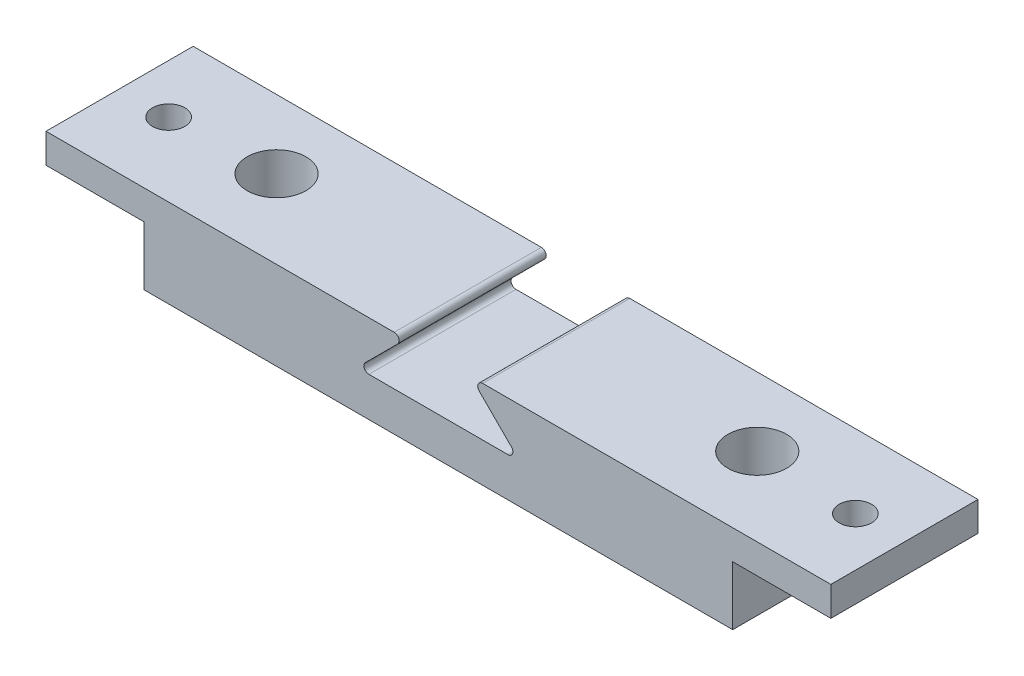
ISO-10303-21;
HEADER;
FILE_DESCRIPTION(('STEP AP214'),'2;1');
FILE_NAME('part.step','',(''),(''),'','','');
FILE_SCHEMA(('AUTOMOTIVE_DESIGN { 1 0 10303 214 1 1 1 1 }'));
ENDSEC;
DATA;
#1=APPLICATION_CONTEXT('core data for automotive mechanical design processes');
#2=APPLICATION_PROTOCOL_DEFINITION('international standard','automotive_design',2000,#1);
#3=PRODUCT_CONTEXT('',#1,'mechanical');
#4=PRODUCT('Part','Part','',(#3));
#5=PRODUCT_RELATED_PRODUCT_CATEGORY('part','',(#4));
#6=PRODUCT_DEFINITION_FORMATION('','',#4);
#7=PRODUCT_DEFINITION_CONTEXT('part definition',#1,'design');
#8=PRODUCT_DEFINITION('design','',#6,#7);
#9=PRODUCT_DEFINITION_SHAPE('','',#8);
#10=(LENGTH_UNIT() NAMED_UNIT(*) SI_UNIT(.MILLI.,.METRE.));
#11=(NAMED_UNIT(*) PLANE_ANGLE_UNIT() SI_UNIT($,.RADIAN.));
#12=(NAMED_UNIT(*) SI_UNIT($,.STERADIAN.) SOLID_ANGLE_UNIT());
#13=UNCERTAINTY_MEASURE_WITH_UNIT(LENGTH_MEASURE(1.E-05),#10,'distance_accuracy_value','');
#14=(GEOMETRIC_REPRESENTATION_CONTEXT(3) GLOBAL_UNCERTAINTY_ASSIGNED_CONTEXT((#13)) GLOBAL_UNIT_ASSIGNED_CONTEXT((#10,
#11,#12)) REPRESENTATION_CONTEXT('',''));
#15=CARTESIAN_POINT('',(0.,0.,0.));
#16=DIRECTION('',(0.,0.,1.));
#17=DIRECTION('',(1.,0.,0.));
#18=AXIS2_PLACEMENT_3D('',#15,#16,#17);
#19=CARTESIAN_POINT('',(0.,9.,0.));
#20=DIRECTION('',(0.,-1.,0.));
#21=DIRECTION('',(0.,0.,-1.));
#22=AXIS2_PLACEMENT_3D('',#19,#20,#21);
#23=PLANE('',#22);
#24=CARTESIAN_POINT('',(35.0000000000021,9.,0.));
#25=DIRECTION('',(0.,1.,0.));
#26=DIRECTION('',(0.,0.,1.));
#27=AXIS2_PLACEMENT_3D('',#24,#25,#26);
#28=CIRCLE('',#27,1.65);
#29=CARTESIAN_POINT('',(35.0000000000021,9.,1.65));
#30=VERTEX_POINT('',#29);
#31=EDGE_CURVE('E278',#30,#30,#28,.T.);
#32=ORIENTED_EDGE('',*,*,#31,.F.);
#33=EDGE_LOOP('',(#32));
#34=FACE_BOUND('',#33,.T.);
#35=CARTESIAN_POINT('',(24.5,9.,-0.500000000000009));
#36=DIRECTION('',(0.,1.,0.));
#37=DIRECTION('',(0.,0.,1.));
#38=AXIS2_PLACEMENT_3D('',#35,#36,#37);
#39=CIRCLE('',#38,3.);
#40=CARTESIAN_POINT('',(24.5,9.,2.49999999999999));
#41=VERTEX_POINT('',#40);
#42=EDGE_CURVE('E287',#41,#41,#39,.T.);
#43=ORIENTED_EDGE('',*,*,#42,.F.);
#44=EDGE_LOOP('',(#43));
#45=FACE_BOUND('',#44,.T.);
#46=DIRECTION('',(0.,0.,1.));
#47=VECTOR('',#46,1.);
#48=CARTESIAN_POINT('',(4.50710678118635,9.,-7.50000000000004));
#49=LINE('',#48,#47);
#50=CARTESIAN_POINT('',(4.50710678118635,9.,-7.50000000000004));
#51=VERTEX_POINT('',#50);
#52=CARTESIAN_POINT('',(4.50710678118635,9.,7.5));
#53=VERTEX_POINT('',#52);
#54=EDGE_CURVE('E267',#51,#53,#49,.T.);
#55=ORIENTED_EDGE('',*,*,#54,.T.);
#56=DIRECTION('',(-1.,0.,0.));
#57=VECTOR('',#56,1.);
#58=CARTESIAN_POINT('',(0.,9.,7.5));
#59=LINE('',#58,#57);
#60=CARTESIAN_POINT('',(40.,9.,7.49999999999996));
#61=VERTEX_POINT('',#60);
#62=EDGE_CURVE('E304',#61,#53,#59,.T.);
#63=ORIENTED_EDGE('',*,*,#62,.F.);
#64=DIRECTION('',(0.,0.,-1.));
#65=VECTOR('',#64,1.);
#66=CARTESIAN_POINT('',(40.,9.,0.));
#67=LINE('',#66,#65);
#68=CARTESIAN_POINT('',(40.,9.,-7.50000000000004));
#69=VERTEX_POINT('',#68);
#70=EDGE_CURVE('E307',#61,#69,#67,.T.);
#71=ORIENTED_EDGE('',*,*,#70,.T.);
#72=DIRECTION('',(-1.,0.,0.));
#73=VECTOR('',#72,1.);
#74=CARTESIAN_POINT('',(0.,9.,-7.50000000000004));
#75=LINE('',#74,#73);
#76=EDGE_CURVE('E296',#69,#51,#75,.T.);
#77=ORIENTED_EDGE('',*,*,#76,.T.);
#78=EDGE_LOOP('',(#55,#63,#71,#77));
#79=FACE_BOUND('',#78,.T.);
#80=ADVANCED_FACE('F95',(#34,#45,#79),#23,.F.);
#81=CARTESIAN_POINT('',(30.,6.,0.));
#82=DIRECTION('',(1.,0.,0.));
#83=DIRECTION('',(0.,0.,-1.));
#84=AXIS2_PLACEMENT_3D('',#81,#82,#83);
#85=PLANE('',#84);
#86=DIRECTION('',(0.,0.,1.));
#87=VECTOR('',#86,1.);
#88=CARTESIAN_POINT('',(30.,0.,0.));
#89=LINE('',#88,#87);
#90=CARTESIAN_POINT('',(30.,0.,-7.50000000000004));
#91=VERTEX_POINT('',#90);
#92=CARTESIAN_POINT('',(30.,0.,7.49999999999997));
#93=VERTEX_POINT('',#92);
#94=EDGE_CURVE('E344',#91,#93,#89,.T.);
#95=ORIENTED_EDGE('',*,*,#94,.F.);
#96=DIRECTION('',(0.,-1.,0.));
#97=VECTOR('',#96,1.);
#98=CARTESIAN_POINT('',(30.,6.,-7.50000000000004));
#99=LINE('',#98,#97);
#100=CARTESIAN_POINT('',(30.,6.,-7.50000000000004));
#101=VERTEX_POINT('',#100);
#102=EDGE_CURVE('E12',#101,#91,#99,.T.);
#103=ORIENTED_EDGE('',*,*,#102,.F.);
#104=DIRECTION('',(0.,0.,1.));
#105=VECTOR('',#104,1.);
#106=CARTESIAN_POINT('',(30.,6.,0.));
#107=LINE('',#106,#105);
#108=CARTESIAN_POINT('',(30.,6.,7.49999999999997));
#109=VERTEX_POINT('',#108);
#110=EDGE_CURVE('E333',#101,#109,#107,.T.);
#111=ORIENTED_EDGE('',*,*,#110,.T.);
#112=DIRECTION('',(0.,-1.,0.));
#113=VECTOR('',#112,1.);
#114=CARTESIAN_POINT('',(30.,6.,7.49999999999997));
#115=LINE('',#114,#113);
#116=EDGE_CURVE('E119',#109,#93,#115,.T.);
#117=ORIENTED_EDGE('',*,*,#116,.T.);
#118=EDGE_LOOP('',(#95,#103,#111,#117));
#119=FACE_BOUND('',#118,.T.);
#120=ADVANCED_FACE('F368',(#119),#85,.T.);
#121=CARTESIAN_POINT('',(0.,6.,-7.50000000000004));
#122=DIRECTION('',(0.,0.,-1.));
#123=DIRECTION('',(-1.,0.,0.));
#124=AXIS2_PLACEMENT_3D('',#121,#122,#123);
#125=PLANE('',#124);
#126=CARTESIAN_POINT('',(-4.50710678118635,8.5,-7.50000000000004));
#127=DIRECTION('',(0.,0.,-1.));
#128=DIRECTION('',(1.,0.,0.));
#129=AXIS2_PLACEMENT_3D('',#126,#127,#128);
#130=CIRCLE('',#129,0.500000000000001);
#131=CARTESIAN_POINT('',(-4.50710678118635,9.,-7.50000000000004));
#132=VERTEX_POINT('',#131);
#133=CARTESIAN_POINT('',(-4.15355339059305,8.14644660940674,-7.50000000000004));
#134=VERTEX_POINT('',#133);
#135=EDGE_CURVE('E248',#132,#134,#130,.T.);
#136=ORIENTED_EDGE('',*,*,#135,.T.);
#137=DIRECTION('',(-0.707106781186508,-0.707106781186587,0.));
#138=VECTOR('',#137,1.);
#139=CARTESIAN_POINT('',(-7.4464466094069,4.85355339059253,-7.50000000000004));
#140=LINE('',#139,#138);
#141=CARTESIAN_POINT('',(-7.4464466094069,4.85355339059253,-7.50000000000004));
#142=VERTEX_POINT('',#141);
#143=EDGE_CURVE('E218',#134,#142,#140,.T.);
#144=ORIENTED_EDGE('',*,*,#143,.T.);
#145=CARTESIAN_POINT('',(-7.09289321881361,4.49999999999928,-7.50000000000004));
#146=DIRECTION('',(0.,0.,1.));
#147=DIRECTION('',(1.,0.,0.));
#148=AXIS2_PLACEMENT_3D('',#145,#146,#147);
#149=CIRCLE('',#148,0.499999999999999);
#150=CARTESIAN_POINT('',(-7.09289321881361,3.99999999999928,-7.50000000000004));
#151=VERTEX_POINT('',#150);
#152=EDGE_CURVE('E251',#142,#151,#149,.T.);
#153=ORIENTED_EDGE('',*,*,#152,.T.);
#154=DIRECTION('',(1.,0.,0.));
#155=VECTOR('',#154,1.);
#156=CARTESIAN_POINT('',(7.09289321881361,3.99999999999928,-7.50000000000004));
#157=LINE('',#156,#155);
#158=CARTESIAN_POINT('',(7.09289321881361,3.99999999999928,-7.50000000000004));
#159=VERTEX_POINT('',#158);
#160=EDGE_CURVE('E254',#151,#159,#157,.T.);
#161=ORIENTED_EDGE('',*,*,#160,.T.);
#162=CARTESIAN_POINT('',(7.09289321881361,4.49999999999928,-7.50000000000004));
#163=DIRECTION('',(0.,0.,1.));
#164=DIRECTION('',(-1.,0.,0.));
#165=AXIS2_PLACEMENT_3D('',#162,#163,#164);
#166=CIRCLE('',#165,0.5);
#167=CARTESIAN_POINT('',(7.4464466094069,4.85355339059253,-7.50000000000004));
#168=VERTEX_POINT('',#167);
#169=EDGE_CURVE('E257',#159,#168,#166,.T.);
#170=ORIENTED_EDGE('',*,*,#169,.T.);
#171=DIRECTION('',(-0.707106781186508,0.707106781186587,0.));
#172=VECTOR('',#171,1.);
#173=CARTESIAN_POINT('',(4.15355339059305,8.14644660940674,-7.50000000000004));
#174=LINE('',#173,#172);
#175=CARTESIAN_POINT('',(4.15355339059305,8.14644660940674,-7.50000000000004));
#176=VERTEX_POINT('',#175);
#177=EDGE_CURVE('E260',#168,#176,#174,.T.);
#178=ORIENTED_EDGE('',*,*,#177,.T.);
#179=CARTESIAN_POINT('',(4.50710678118635,8.5,-7.50000000000004));
#180=DIRECTION('',(0.,0.,-1.));
#181=DIRECTION('',(1.,0.,0.));
#182=AXIS2_PLACEMENT_3D('',#179,#180,#181);
#183=CIRCLE('',#182,0.500000000000001);
#184=EDGE_CURVE('E222',#176,#51,#183,.T.);
#185=ORIENTED_EDGE('',*,*,#184,.T.);
#186=ORIENTED_EDGE('',*,*,#76,.F.);
#187=DIRECTION('',(0.,-1.,0.));
#188=VECTOR('',#187,1.);
#189=CARTESIAN_POINT('',(40.,9.,-7.50000000000004));
#190=LINE('',#189,#188);
#191=CARTESIAN_POINT('',(40.,6.,-7.50000000000004));
#192=VERTEX_POINT('',#191);
#193=EDGE_CURVE('E309',#69,#192,#190,.T.);
#194=ORIENTED_EDGE('',*,*,#193,.T.);
#195=DIRECTION('',(-1.,0.,0.));
#196=VECTOR('',#195,1.);
#197=CARTESIAN_POINT('',(0.,6.,-7.50000000000004));
#198=LINE('',#197,#196);
#199=EDGE_CURVE('E310',#192,#101,#198,.T.);
#200=ORIENTED_EDGE('',*,*,#199,.T.);
#201=ORIENTED_EDGE('',*,*,#102,.T.);
#202=DIRECTION('',(1.,0.,0.));
#203=VECTOR('',#202,1.);
#204=CARTESIAN_POINT('',(0.,0.,-7.50000000000004));
#205=LINE('',#204,#203);
#206=CARTESIAN_POINT('',(-30.,0.,-7.50000000000004));
#207=VERTEX_POINT('',#206);
#208=EDGE_CURVE('E347',#207,#91,#205,.T.);
#209=ORIENTED_EDGE('',*,*,#208,.F.);
#210=DIRECTION('',(0.,-1.,0.));
#211=VECTOR('',#210,1.);
#212=CARTESIAN_POINT('',(-30.,6.,-7.50000000000004));
#213=LINE('',#212,#211);
#214=CARTESIAN_POINT('',(-30.,6.,-7.50000000000004));
#215=VERTEX_POINT('',#214);
#216=EDGE_CURVE('E103',#215,#207,#213,.T.);
#217=ORIENTED_EDGE('',*,*,#216,.F.);
#218=CARTESIAN_POINT('',(-40.,6.,-7.50000000000004));
#219=VERTEX_POINT('',#218);
#220=EDGE_CURVE('E295',#215,#219,#198,.T.);
#221=ORIENTED_EDGE('',*,*,#220,.T.);
#222=DIRECTION('',(0.,-1.,0.));
#223=VECTOR('',#222,1.);
#224=CARTESIAN_POINT('',(-40.,9.,-7.50000000000004));
#225=LINE('',#224,#223);
#226=CARTESIAN_POINT('',(-40.,9.,-7.50000000000004));
#227=VERTEX_POINT('',#226);
#228=EDGE_CURVE('E329',#227,#219,#225,.T.);
#229=ORIENTED_EDGE('',*,*,#228,.F.);
#230=EDGE_CURVE('E300',#132,#227,#75,.T.);
#231=ORIENTED_EDGE('',*,*,#230,.F.);
#232=EDGE_LOOP('',(#136,#144,#153,#161,#170,#178,#185,#186,#194,#200,#201,#209,#217,#221,#229,#231));
#233=FACE_BOUND('',#232,.T.);
#234=ADVANCED_FACE('F366',(#233),#125,.T.);
#235=CARTESIAN_POINT('',(-30.,6.,0.));
#236=DIRECTION('',(1.,0.,0.));
#237=DIRECTION('',(0.,0.,-1.));
#238=AXIS2_PLACEMENT_3D('',#235,#236,#237);
#239=PLANE('',#238);
#240=DIRECTION('',(0.,0.,1.));
#241=VECTOR('',#240,1.);
#242=CARTESIAN_POINT('',(-30.,0.,0.));
#243=LINE('',#242,#241);
#244=CARTESIAN_POINT('',(-30.,0.,7.50000000000003));
#245=VERTEX_POINT('',#244);
#246=EDGE_CURVE('E350',#207,#245,#243,.T.);
#247=ORIENTED_EDGE('',*,*,#246,.T.);
#248=DIRECTION('',(0.,-1.,0.));
#249=VECTOR('',#248,1.);
#250=CARTESIAN_POINT('',(-30.,6.,7.50000000000003));
#251=LINE('',#250,#249);
#252=CARTESIAN_POINT('',(-30.,6.,7.50000000000003));
#253=VERTEX_POINT('',#252);
#254=EDGE_CURVE('E355',#253,#245,#251,.T.);
#255=ORIENTED_EDGE('',*,*,#254,.F.);
#256=DIRECTION('',(0.,0.,1.));
#257=VECTOR('',#256,1.);
#258=CARTESIAN_POINT('',(-30.,6.,0.));
#259=LINE('',#258,#257);
#260=EDGE_CURVE('E335',#215,#253,#259,.T.);
#261=ORIENTED_EDGE('',*,*,#260,.F.);
#262=ORIENTED_EDGE('',*,*,#216,.T.);
#263=EDGE_LOOP('',(#247,#255,#261,#262));
#264=FACE_BOUND('',#263,.T.);
#265=ADVANCED_FACE('F360',(#264),#239,.F.);
#266=CARTESIAN_POINT('',(-24.5,6.,-0.5));
#267=DIRECTION('',(0.,-1.,0.));
#268=DIRECTION('',(0.,0.,-1.));
#269=AXIS2_PLACEMENT_3D('',#266,#267,#268);
#270=CYLINDRICAL_SURFACE('',#269,3.);
#271=CARTESIAN_POINT('',(-24.5,0.,-0.5));
#272=DIRECTION('',(0.,1.,0.));
#273=DIRECTION('',(0.,0.,1.));
#274=AXIS2_PLACEMENT_3D('',#271,#272,#273);
#275=CIRCLE('',#274,3.);
#276=CARTESIAN_POINT('',(-24.5,0.,2.5));
#277=VERTEX_POINT('',#276);
#278=EDGE_CURVE('E341',#277,#277,#275,.T.);
#279=ORIENTED_EDGE('',*,*,#278,.F.);
#280=EDGE_LOOP('',(#279));
#281=FACE_BOUND('',#280,.T.);
#282=CARTESIAN_POINT('',(-24.5,9.,-0.5));
#283=DIRECTION('',(0.,1.,0.));
#284=DIRECTION('',(0.,0.,1.));
#285=AXIS2_PLACEMENT_3D('',#282,#283,#284);
#286=CIRCLE('',#285,3.);
#287=CARTESIAN_POINT('',(-24.5,9.,2.5));
#288=VERTEX_POINT('',#287);
#289=EDGE_CURVE('E292',#288,#288,#286,.T.);
#290=ORIENTED_EDGE('',*,*,#289,.T.);
#291=EDGE_LOOP('',(#290));
#292=FACE_BOUND('',#291,.T.);
#293=ADVANCED_FACE('F380',(#281,#292),#270,.F.);
#294=CARTESIAN_POINT('',(24.5,6.,-0.500000000000009));
#295=DIRECTION('',(0.,-1.,0.));
#296=DIRECTION('',(0.,0.,-1.));
#297=AXIS2_PLACEMENT_3D('',#294,#295,#296);
#298=CYLINDRICAL_SURFACE('',#297,3.);
#299=CARTESIAN_POINT('',(24.5,0.,-0.500000000000009));
#300=DIRECTION('',(0.,1.,0.));
#301=DIRECTION('',(0.,0.,1.));
#302=AXIS2_PLACEMENT_3D('',#299,#300,#301);
#303=CIRCLE('',#302,3.);
#304=CARTESIAN_POINT('',(24.5,0.,2.49999999999999));
#305=VERTEX_POINT('',#304);
#306=EDGE_CURVE('E332',#305,#305,#303,.T.);
#307=ORIENTED_EDGE('',*,*,#306,.F.);
#308=EDGE_LOOP('',(#307));
#309=FACE_BOUND('',#308,.T.);
#310=ORIENTED_EDGE('',*,*,#42,.T.);
#311=EDGE_LOOP('',(#310));
#312=FACE_BOUND('',#311,.T.);
#313=ADVANCED_FACE('F97',(#309,#312),#298,.F.);
#314=CARTESIAN_POINT('',(0.,6.,7.5));
#315=DIRECTION('',(0.,0.,-1.));
#316=DIRECTION('',(-1.,0.,0.));
#317=AXIS2_PLACEMENT_3D('',#314,#315,#316);
#318=PLANE('',#317);
#319=DIRECTION('',(-0.707106781186508,-0.707106781186587,0.));
#320=VECTOR('',#319,1.);
#321=CARTESIAN_POINT('',(-7.4464466094069,4.85355339059253,7.50000000000004));
#322=LINE('',#321,#320);
#323=CARTESIAN_POINT('',(-4.15355339059305,8.14644660940674,7.50000000000004));
#324=VERTEX_POINT('',#323);
#325=CARTESIAN_POINT('',(-7.4464466094069,4.85355339059253,7.50000000000004));
#326=VERTEX_POINT('',#325);
#327=EDGE_CURVE('E215',#324,#326,#322,.T.);
#328=ORIENTED_EDGE('',*,*,#327,.F.);
#329=CARTESIAN_POINT('',(-4.50710678118635,8.5,7.50000000000004));
#330=DIRECTION('',(0.,0.,-1.));
#331=DIRECTION('',(1.,0.,0.));
#332=AXIS2_PLACEMENT_3D('',#329,#330,#331);
#333=CIRCLE('',#332,0.500000000000001);
#334=CARTESIAN_POINT('',(-4.50710678118635,9.,7.50000000000004));
#335=VERTEX_POINT('',#334);
#336=EDGE_CURVE('E225',#335,#324,#333,.T.);
#337=ORIENTED_EDGE('',*,*,#336,.F.);
#338=CARTESIAN_POINT('',(-40.,9.,7.50000000000004));
#339=VERTEX_POINT('',#338);
#340=EDGE_CURVE('E303',#335,#339,#59,.T.);
#341=ORIENTED_EDGE('',*,*,#340,.T.);
#342=DIRECTION('',(0.,-1.,0.));
#343=VECTOR('',#342,1.);
#344=CARTESIAN_POINT('',(-40.,9.,7.50000000000004));
#345=LINE('',#344,#343);
#346=CARTESIAN_POINT('',(-40.,6.,7.50000000000004));
#347=VERTEX_POINT('',#346);
#348=EDGE_CURVE('E326',#339,#347,#345,.T.);
#349=ORIENTED_EDGE('',*,*,#348,.T.);
#350=DIRECTION('',(-1.,0.,0.));
#351=VECTOR('',#350,1.);
#352=CARTESIAN_POINT('',(0.,6.,7.5));
#353=LINE('',#352,#351);
#354=EDGE_CURVE('E316',#253,#347,#353,.T.);
#355=ORIENTED_EDGE('',*,*,#354,.F.);
#356=ORIENTED_EDGE('',*,*,#254,.T.);
#357=DIRECTION('',(1.,0.,0.));
#358=VECTOR('',#357,1.);
#359=CARTESIAN_POINT('',(0.,0.,7.5));
#360=LINE('',#359,#358);
#361=EDGE_CURVE('E336',#245,#93,#360,.T.);
#362=ORIENTED_EDGE('',*,*,#361,.T.);
#363=ORIENTED_EDGE('',*,*,#116,.F.);
#364=CARTESIAN_POINT('',(40.,6.,7.49999999999996));
#365=VERTEX_POINT('',#364);
#366=EDGE_CURVE('E317',#365,#109,#353,.T.);
#367=ORIENTED_EDGE('',*,*,#366,.F.);
#368=DIRECTION('',(0.,-1.,0.));
#369=VECTOR('',#368,1.);
#370=CARTESIAN_POINT('',(40.,9.,7.49999999999996));
#371=LINE('',#370,#369);
#372=EDGE_CURVE('E324',#61,#365,#371,.T.);
#373=ORIENTED_EDGE('',*,*,#372,.F.);
#374=ORIENTED_EDGE('',*,*,#62,.T.);
#375=CARTESIAN_POINT('',(4.50710678118635,8.5,7.50000000000004));
#376=DIRECTION('',(0.,0.,-1.));
#377=DIRECTION('',(1.,0.,0.));
#378=AXIS2_PLACEMENT_3D('',#375,#376,#377);
#379=CIRCLE('',#378,0.500000000000001);
#380=CARTESIAN_POINT('',(4.15355339059305,8.14644660940674,7.50000000000004));
#381=VERTEX_POINT('',#380);
#382=EDGE_CURVE('E110',#381,#53,#379,.T.);
#383=ORIENTED_EDGE('',*,*,#382,.F.);
#384=DIRECTION('',(-0.707106781186508,0.707106781186587,0.));
#385=VECTOR('',#384,1.);
#386=CARTESIAN_POINT('',(4.15355339059305,8.14644660940674,7.50000000000004));
#387=LINE('',#386,#385);
#388=CARTESIAN_POINT('',(7.4464466094069,4.85355339059253,7.50000000000004));
#389=VERTEX_POINT('',#388);
#390=EDGE_CURVE('E244',#389,#381,#387,.T.);
#391=ORIENTED_EDGE('',*,*,#390,.F.);
#392=CARTESIAN_POINT('',(7.09289321881361,4.49999999999928,7.50000000000004));
#393=DIRECTION('',(0.,0.,1.));
#394=DIRECTION('',(-1.,0.,0.));
#395=AXIS2_PLACEMENT_3D('',#392,#393,#394);
#396=CIRCLE('',#395,0.5);
#397=CARTESIAN_POINT('',(7.09289321881361,3.99999999999928,7.50000000000004));
#398=VERTEX_POINT('',#397);
#399=EDGE_CURVE('E241',#398,#389,#396,.T.);
#400=ORIENTED_EDGE('',*,*,#399,.F.);
#401=DIRECTION('',(1.,0.,0.));
#402=VECTOR('',#401,1.);
#403=CARTESIAN_POINT('',(7.09289321881361,3.99999999999928,7.50000000000004));
#404=LINE('',#403,#402);
#405=CARTESIAN_POINT('',(-7.09289321881361,3.99999999999928,7.50000000000004));
#406=VERTEX_POINT('',#405);
#407=EDGE_CURVE('E236',#406,#398,#404,.T.);
#408=ORIENTED_EDGE('',*,*,#407,.F.);
#409=CARTESIAN_POINT('',(-7.09289321881361,4.49999999999928,7.50000000000004));
#410=DIRECTION('',(0.,0.,1.));
#411=DIRECTION('',(1.,0.,0.));
#412=AXIS2_PLACEMENT_3D('',#409,#410,#411);
#413=CIRCLE('',#412,0.499999999999999);
#414=EDGE_CURVE('E234',#326,#406,#413,.T.);
#415=ORIENTED_EDGE('',*,*,#414,.F.);
#416=EDGE_LOOP('',(#328,#337,#341,#349,#355,#356,#362,#363,#367,#373,#374,#383,#391,#400,#408,#415));
#417=FACE_BOUND('',#416,.T.);
#418=ADVANCED_FACE('F231',(#417),#318,.F.);
#419=CARTESIAN_POINT('',(0.,0.,0.));
#420=DIRECTION('',(0.,1.,0.));
#421=DIRECTION('',(0.,0.,1.));
#422=AXIS2_PLACEMENT_3D('',#419,#420,#421);
#423=PLANE('',#422);
#424=ORIENTED_EDGE('',*,*,#306,.T.);
#425=EDGE_LOOP('',(#424));
#426=FACE_BOUND('',#425,.T.);
#427=ORIENTED_EDGE('',*,*,#278,.T.);
#428=EDGE_LOOP('',(#427));
#429=FACE_BOUND('',#428,.T.);
#430=ORIENTED_EDGE('',*,*,#94,.T.);
#431=ORIENTED_EDGE('',*,*,#361,.F.);
#432=ORIENTED_EDGE('',*,*,#246,.F.);
#433=ORIENTED_EDGE('',*,*,#208,.T.);
#434=EDGE_LOOP('',(#430,#431,#432,#433));
#435=FACE_BOUND('',#434,.T.);
#436=ADVANCED_FACE('F365',(#426,#429,#435),#423,.F.);
#437=CARTESIAN_POINT('',(0.,6.,0.));
#438=DIRECTION('',(0.,-1.,0.));
#439=DIRECTION('',(0.,0.,-1.));
#440=AXIS2_PLACEMENT_3D('',#437,#438,#439);
#441=PLANE('',#440);
#442=CARTESIAN_POINT('',(35.0000000000021,6.,0.));
#443=DIRECTION('',(0.,1.,0.));
#444=DIRECTION('',(0.,0.,1.));
#445=AXIS2_PLACEMENT_3D('',#442,#443,#444);
#446=CIRCLE('',#445,1.65);
#447=CARTESIAN_POINT('',(35.0000000000021,6.,1.65));
#448=VERTEX_POINT('',#447);
#449=EDGE_CURVE('E266',#448,#448,#446,.T.);
#450=ORIENTED_EDGE('',*,*,#449,.T.);
#451=EDGE_LOOP('',(#450));
#452=FACE_BOUND('',#451,.T.);
#453=ORIENTED_EDGE('',*,*,#110,.F.);
#454=ORIENTED_EDGE('',*,*,#199,.F.);
#455=DIRECTION('',(0.,0.,-1.));
#456=VECTOR('',#455,1.);
#457=CARTESIAN_POINT('',(40.,6.,0.));
#458=LINE('',#457,#456);
#459=EDGE_CURVE('E320',#365,#192,#458,.T.);
#460=ORIENTED_EDGE('',*,*,#459,.F.);
#461=ORIENTED_EDGE('',*,*,#366,.T.);
#462=EDGE_LOOP('',(#453,#454,#460,#461));
#463=FACE_BOUND('',#462,.T.);
#464=ADVANCED_FACE('F395',(#452,#463),#441,.T.);
#465=ORIENTED_EDGE('',*,*,#340,.F.);
#466=DIRECTION('',(0.,0.,1.));
#467=VECTOR('',#466,1.);
#468=CARTESIAN_POINT('',(-4.50710678118635,9.,-7.50000000000004));
#469=LINE('',#468,#467);
#470=EDGE_CURVE('E228',#132,#335,#469,.T.);
#471=ORIENTED_EDGE('',*,*,#470,.F.);
#472=ORIENTED_EDGE('',*,*,#230,.T.);
#473=DIRECTION('',(0.,0.,-1.));
#474=VECTOR('',#473,1.);
#475=CARTESIAN_POINT('',(-40.,9.,0.));
#476=LINE('',#475,#474);
#477=EDGE_CURVE('E299',#339,#227,#476,.T.);
#478=ORIENTED_EDGE('',*,*,#477,.F.);
#479=EDGE_LOOP('',(#465,#471,#472,#478));
#480=FACE_BOUND('',#479,.T.);
#481=ORIENTED_EDGE('',*,*,#289,.F.);
#482=EDGE_LOOP('',(#481));
#483=FACE_BOUND('',#482,.T.);
#484=CARTESIAN_POINT('',(-34.9999999999979,9.,0.));
#485=DIRECTION('',(0.,1.,0.));
#486=DIRECTION('',(0.,0.,1.));
#487=AXIS2_PLACEMENT_3D('',#484,#485,#486);
#488=CIRCLE('',#487,1.65);
#489=CARTESIAN_POINT('',(-34.9999999999979,9.,1.65));
#490=VERTEX_POINT('',#489);
#491=EDGE_CURVE('E284',#490,#490,#488,.T.);
#492=ORIENTED_EDGE('',*,*,#491,.F.);
#493=EDGE_LOOP('',(#492));
#494=FACE_BOUND('',#493,.T.);
#495=ADVANCED_FACE('F378',(#480,#483,#494),#23,.F.);
#496=CARTESIAN_POINT('',(-34.9999999999979,6.,0.));
#497=DIRECTION('',(0.,1.,0.));
#498=DIRECTION('',(0.,0.,1.));
#499=AXIS2_PLACEMENT_3D('',#496,#497,#498);
#500=CIRCLE('',#499,1.65);
#501=CARTESIAN_POINT('',(-34.9999999999979,6.,1.65));
#502=VERTEX_POINT('',#501);
#503=EDGE_CURVE('E281',#502,#502,#500,.T.);
#504=ORIENTED_EDGE('',*,*,#503,.T.);
#505=EDGE_LOOP('',(#504));
#506=FACE_BOUND('',#505,.T.);
#507=ORIENTED_EDGE('',*,*,#220,.F.);
#508=ORIENTED_EDGE('',*,*,#260,.T.);
#509=ORIENTED_EDGE('',*,*,#354,.T.);
#510=DIRECTION('',(0.,0.,-1.));
#511=VECTOR('',#510,1.);
#512=CARTESIAN_POINT('',(-40.,6.,0.));
#513=LINE('',#512,#511);
#514=EDGE_CURVE('E313',#347,#219,#513,.T.);
#515=ORIENTED_EDGE('',*,*,#514,.T.);
#516=EDGE_LOOP('',(#507,#508,#509,#515));
#517=FACE_BOUND('',#516,.T.);
#518=ADVANCED_FACE('F394',(#506,#517),#441,.T.);
#519=CARTESIAN_POINT('',(-40.,9.,0.));
#520=DIRECTION('',(-1.,0.,0.));
#521=DIRECTION('',(0.,0.,1.));
#522=AXIS2_PLACEMENT_3D('',#519,#520,#521);
#523=PLANE('',#522);
#524=ORIENTED_EDGE('',*,*,#514,.F.);
#525=ORIENTED_EDGE('',*,*,#348,.F.);
#526=ORIENTED_EDGE('',*,*,#477,.T.);
#527=ORIENTED_EDGE('',*,*,#228,.T.);
#528=EDGE_LOOP('',(#524,#525,#526,#527));
#529=FACE_BOUND('',#528,.T.);
#530=ADVANCED_FACE('F409',(#529),#523,.T.);
#531=CARTESIAN_POINT('',(40.,9.,0.));
#532=DIRECTION('',(-1.,0.,0.));
#533=DIRECTION('',(0.,0.,1.));
#534=AXIS2_PLACEMENT_3D('',#531,#532,#533);
#535=PLANE('',#534);
#536=ORIENTED_EDGE('',*,*,#459,.T.);
#537=ORIENTED_EDGE('',*,*,#193,.F.);
#538=ORIENTED_EDGE('',*,*,#70,.F.);
#539=ORIENTED_EDGE('',*,*,#372,.T.);
#540=EDGE_LOOP('',(#536,#537,#538,#539));
#541=FACE_BOUND('',#540,.T.);
#542=ADVANCED_FACE('F403',(#541),#535,.F.);
#543=CARTESIAN_POINT('',(-34.9999999999979,9.,0.));
#544=DIRECTION('',(0.,-1.,0.));
#545=DIRECTION('',(0.,0.,-1.));
#546=AXIS2_PLACEMENT_3D('',#543,#544,#545);
#547=CYLINDRICAL_SURFACE('',#546,1.65);
#548=ORIENTED_EDGE('',*,*,#491,.T.);
#549=EDGE_LOOP('',(#548));
#550=FACE_BOUND('',#549,.T.);
#551=ORIENTED_EDGE('',*,*,#503,.F.);
#552=EDGE_LOOP('',(#551));
#553=FACE_BOUND('',#552,.T.);
#554=ADVANCED_FACE('F399',(#550,#553),#547,.F.);
#555=CARTESIAN_POINT('',(35.0000000000021,9.,0.));
#556=DIRECTION('',(0.,-1.,0.));
#557=DIRECTION('',(0.,0.,-1.));
#558=AXIS2_PLACEMENT_3D('',#555,#556,#557);
#559=CYLINDRICAL_SURFACE('',#558,1.65);
#560=ORIENTED_EDGE('',*,*,#31,.T.);
#561=EDGE_LOOP('',(#560));
#562=FACE_BOUND('',#561,.T.);
#563=ORIENTED_EDGE('',*,*,#449,.F.);
#564=EDGE_LOOP('',(#563));
#565=FACE_BOUND('',#564,.T.);
#566=ADVANCED_FACE('F402',(#562,#565),#559,.F.);
#567=CARTESIAN_POINT('',(-4.50710678118635,8.5,-7.50000000000004));
#568=DIRECTION('',(0.,0.,1.));
#569=DIRECTION('',(1.,0.,0.));
#570=AXIS2_PLACEMENT_3D('',#567,#568,#569);
#571=CYLINDRICAL_SURFACE('',#570,0.500000000000001);
#572=DIRECTION('',(0.,0.,1.));
#573=VECTOR('',#572,1.);
#574=CARTESIAN_POINT('',(-4.15355339059305,8.14644660940674,-7.50000000000004));
#575=LINE('',#574,#573);
#576=EDGE_CURVE('E211',#134,#324,#575,.T.);
#577=ORIENTED_EDGE('',*,*,#576,.F.);
#578=ORIENTED_EDGE('',*,*,#135,.F.);
#579=ORIENTED_EDGE('',*,*,#470,.T.);
#580=ORIENTED_EDGE('',*,*,#336,.T.);
#581=EDGE_LOOP('',(#577,#578,#579,#580));
#582=FACE_BOUND('',#581,.T.);
#583=ADVANCED_FACE('F226',(#582),#571,.T.);
#584=CARTESIAN_POINT('',(4.50710678118635,8.5,-7.50000000000004));
#585=DIRECTION('',(0.,0.,1.));
#586=DIRECTION('',(1.,0.,0.));
#587=AXIS2_PLACEMENT_3D('',#584,#585,#586);
#588=CYLINDRICAL_SURFACE('',#587,0.500000000000001);
#589=ORIENTED_EDGE('',*,*,#54,.F.);
#590=ORIENTED_EDGE('',*,*,#184,.F.);
#591=DIRECTION('',(0.,0.,1.));
#592=VECTOR('',#591,1.);
#593=CARTESIAN_POINT('',(4.15355339059305,8.14644660940674,-7.50000000000004));
#594=LINE('',#593,#592);
#595=EDGE_CURVE('E269',#176,#381,#594,.T.);
#596=ORIENTED_EDGE('',*,*,#595,.T.);
#597=ORIENTED_EDGE('',*,*,#382,.T.);
#598=EDGE_LOOP('',(#589,#590,#596,#597));
#599=FACE_BOUND('',#598,.T.);
#600=ADVANCED_FACE('F434',(#599),#588,.T.);
#601=CARTESIAN_POINT('',(4.15355339059305,8.14644660940674,-7.50000000000004));
#602=DIRECTION('',(0.707106781186587,0.707106781186508,0.));
#603=DIRECTION('',(-0.707106781186508,0.707106781186587,0.));
#604=AXIS2_PLACEMENT_3D('',#601,#602,#603);
#605=PLANE('',#604);
#606=ORIENTED_EDGE('',*,*,#595,.F.);
#607=ORIENTED_EDGE('',*,*,#177,.F.);
#608=DIRECTION('',(0.,0.,1.));
#609=VECTOR('',#608,1.);
#610=CARTESIAN_POINT('',(7.4464466094069,4.85355339059253,-7.50000000000004));
#611=LINE('',#610,#609);
#612=EDGE_CURVE('E271',#168,#389,#611,.T.);
#613=ORIENTED_EDGE('',*,*,#612,.T.);
#614=ORIENTED_EDGE('',*,*,#390,.T.);
#615=EDGE_LOOP('',(#606,#607,#613,#614));
#616=FACE_BOUND('',#615,.T.);
#617=ADVANCED_FACE('F432',(#616),#605,.F.);
#618=CARTESIAN_POINT('',(7.09289321881361,4.49999999999928,-7.50000000000004));
#619=DIRECTION('',(0.,0.,1.));
#620=DIRECTION('',(1.,0.,0.));
#621=AXIS2_PLACEMENT_3D('',#618,#619,#620);
#622=CYLINDRICAL_SURFACE('',#621,0.5);
#623=ORIENTED_EDGE('',*,*,#612,.F.);
#624=ORIENTED_EDGE('',*,*,#169,.F.);
#625=DIRECTION('',(0.,0.,1.));
#626=VECTOR('',#625,1.);
#627=CARTESIAN_POINT('',(7.09289321881361,3.99999999999928,-7.50000000000004));
#628=LINE('',#627,#626);
#629=EDGE_CURVE('E273',#159,#398,#628,.T.);
#630=ORIENTED_EDGE('',*,*,#629,.T.);
#631=ORIENTED_EDGE('',*,*,#399,.T.);
#632=EDGE_LOOP('',(#623,#624,#630,#631));
#633=FACE_BOUND('',#632,.T.);
#634=ADVANCED_FACE('F427',(#633),#622,.F.);
#635=CARTESIAN_POINT('',(7.09289321881361,3.99999999999928,-7.50000000000004));
#636=DIRECTION('',(0.,-1.,0.));
#637=DIRECTION('',(1.,0.,0.));
#638=AXIS2_PLACEMENT_3D('',#635,#636,#637);
#639=PLANE('',#638);
#640=ORIENTED_EDGE('',*,*,#629,.F.);
#641=ORIENTED_EDGE('',*,*,#160,.F.);
#642=DIRECTION('',(0.,0.,1.));
#643=VECTOR('',#642,1.);
#644=CARTESIAN_POINT('',(-7.09289321881361,3.99999999999928,-7.50000000000004));
#645=LINE('',#644,#643);
#646=EDGE_CURVE('E275',#151,#406,#645,.T.);
#647=ORIENTED_EDGE('',*,*,#646,.T.);
#648=ORIENTED_EDGE('',*,*,#407,.T.);
#649=EDGE_LOOP('',(#640,#641,#647,#648));
#650=FACE_BOUND('',#649,.T.);
#651=ADVANCED_FACE('F423',(#650),#639,.F.);
#652=CARTESIAN_POINT('',(-7.09289321881361,4.49999999999928,-7.50000000000004));
#653=DIRECTION('',(0.,0.,1.));
#654=DIRECTION('',(1.,0.,0.));
#655=AXIS2_PLACEMENT_3D('',#652,#653,#654);
#656=CYLINDRICAL_SURFACE('',#655,0.499999999999999);
#657=ORIENTED_EDGE('',*,*,#646,.F.);
#658=ORIENTED_EDGE('',*,*,#152,.F.);
#659=DIRECTION('',(0.,0.,1.));
#660=VECTOR('',#659,1.);
#661=CARTESIAN_POINT('',(-7.4464466094069,4.85355339059253,-7.50000000000004));
#662=LINE('',#661,#660);
#663=EDGE_CURVE('E221',#142,#326,#662,.T.);
#664=ORIENTED_EDGE('',*,*,#663,.T.);
#665=ORIENTED_EDGE('',*,*,#414,.T.);
#666=EDGE_LOOP('',(#657,#658,#664,#665));
#667=FACE_BOUND('',#666,.T.);
#668=ADVANCED_FACE('F421',(#667),#656,.F.);
#669=CARTESIAN_POINT('',(-7.4464466094069,4.85355339059253,-7.50000000000004));
#670=DIRECTION('',(-0.707106781186587,0.707106781186508,0.));
#671=DIRECTION('',(-0.707106781186508,-0.707106781186587,0.));
#672=AXIS2_PLACEMENT_3D('',#669,#670,#671);
#673=PLANE('',#672);
#674=ORIENTED_EDGE('',*,*,#663,.F.);
#675=ORIENTED_EDGE('',*,*,#143,.F.);
#676=ORIENTED_EDGE('',*,*,#576,.T.);
#677=ORIENTED_EDGE('',*,*,#327,.T.);
#678=EDGE_LOOP('',(#674,#675,#676,#677));
#679=FACE_BOUND('',#678,.T.);
#680=ADVANCED_FACE('F213',(#679),#673,.F.);
#681=CLOSED_SHELL('',(#80,#120,#234,#265,#293,#313,#418,#436,#464,#495,#518,#530,#542,#554,#566,
#583,#600,#617,#634,#651,#668,#680));
#682=MANIFOLD_SOLID_BREP('B2',#681);
#683=ADVANCED_BREP_SHAPE_REPRESENTATION('',(#18,#682),#14);
#684=SHAPE_DEFINITION_REPRESENTATION(#9,#683);
ENDSEC;
END-ISO-10303-21;
